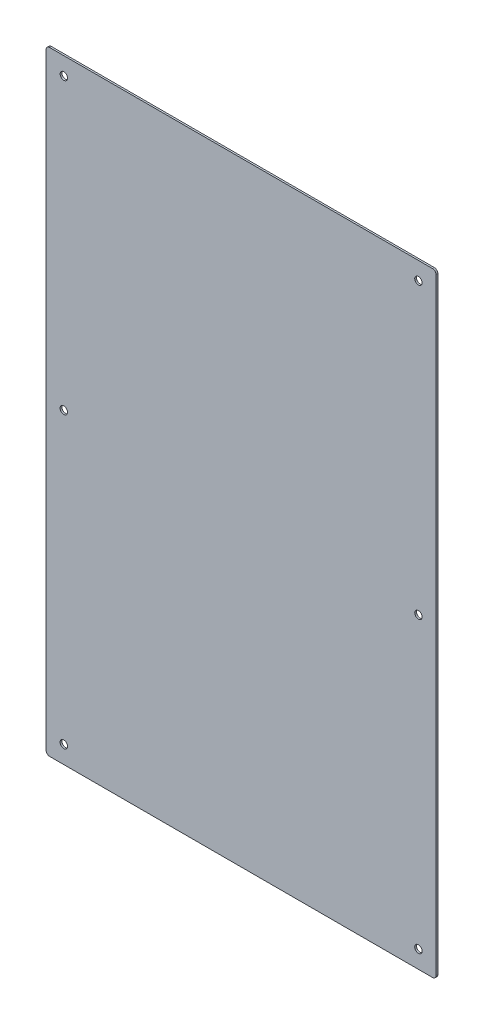
ISO-10303-21;
HEADER;
FILE_DESCRIPTION(('STEP AP214'),'2;1');
FILE_NAME('part.step','',(''),(''),'','','');
FILE_SCHEMA(('AUTOMOTIVE_DESIGN { 1 0 10303 214 1 1 1 1 }'));
ENDSEC;
DATA;
#1=APPLICATION_CONTEXT('core data for automotive mechanical design processes');
#2=APPLICATION_PROTOCOL_DEFINITION('international standard','automotive_design',2000,#1);
#3=PRODUCT_CONTEXT('',#1,'mechanical');
#4=PRODUCT('Part','Part','',(#3));
#5=PRODUCT_RELATED_PRODUCT_CATEGORY('part','',(#4));
#6=PRODUCT_DEFINITION_FORMATION('','',#4);
#7=PRODUCT_DEFINITION_CONTEXT('part definition',#1,'design');
#8=PRODUCT_DEFINITION('design','',#6,#7);
#9=PRODUCT_DEFINITION_SHAPE('','',#8);
#10=(LENGTH_UNIT() NAMED_UNIT(*) SI_UNIT(.MILLI.,.METRE.));
#11=(NAMED_UNIT(*) PLANE_ANGLE_UNIT() SI_UNIT($,.RADIAN.));
#12=(NAMED_UNIT(*) SI_UNIT($,.STERADIAN.) SOLID_ANGLE_UNIT());
#13=UNCERTAINTY_MEASURE_WITH_UNIT(LENGTH_MEASURE(1.E-05),#10,'distance_accuracy_value','');
#14=(GEOMETRIC_REPRESENTATION_CONTEXT(3) GLOBAL_UNCERTAINTY_ASSIGNED_CONTEXT((#13)) GLOBAL_UNIT_ASSIGNED_CONTEXT((#10,
#11,#12)) REPRESENTATION_CONTEXT('',''));
#15=CARTESIAN_POINT('',(0.,0.,0.));
#16=DIRECTION('',(0.,0.,1.));
#17=DIRECTION('',(1.,0.,0.));
#18=AXIS2_PLACEMENT_3D('',#15,#16,#17);
#19=CARTESIAN_POINT('',(-108.5,172.,1.));
#20=DIRECTION('',(0.,0.,-1.));
#21=DIRECTION('',(-1.,0.,0.));
#22=AXIS2_PLACEMENT_3D('',#19,#20,#21);
#23=PLANE('',#22);
#24=CARTESIAN_POINT('',(100.5,0.,1.));
#25=DIRECTION('',(0.,0.,1.));
#26=DIRECTION('',(-1.,0.,0.));
#27=AXIS2_PLACEMENT_3D('',#24,#25,#26);
#28=CIRCLE('',#27,2.1);
#29=CARTESIAN_POINT('',(98.4000000000001,0.,1.));
#30=VERTEX_POINT('',#29);
#31=EDGE_CURVE('E198',#30,#30,#28,.T.);
#32=ORIENTED_EDGE('',*,*,#31,.F.);
#33=EDGE_LOOP('',(#32));
#34=FACE_BOUND('',#33,.T.);
#35=CARTESIAN_POINT('',(-100.5,-164.,1.));
#36=DIRECTION('',(0.,0.,1.));
#37=DIRECTION('',(-1.,0.,0.));
#38=AXIS2_PLACEMENT_3D('',#35,#36,#37);
#39=CIRCLE('',#38,2.1);
#40=CARTESIAN_POINT('',(-102.6,-164.,1.));
#41=VERTEX_POINT('',#40);
#42=EDGE_CURVE('E186',#41,#41,#39,.T.);
#43=ORIENTED_EDGE('',*,*,#42,.F.);
#44=EDGE_LOOP('',(#43));
#45=FACE_BOUND('',#44,.T.);
#46=CARTESIAN_POINT('',(-100.5,164.,1.));
#47=DIRECTION('',(0.,0.,1.));
#48=DIRECTION('',(1.,0.,0.));
#49=AXIS2_PLACEMENT_3D('',#46,#47,#48);
#50=CIRCLE('',#49,2.1);
#51=CARTESIAN_POINT('',(-98.4,164.,1.));
#52=VERTEX_POINT('',#51);
#53=EDGE_CURVE('E132',#52,#52,#50,.T.);
#54=ORIENTED_EDGE('',*,*,#53,.F.);
#55=EDGE_LOOP('',(#54));
#56=FACE_BOUND('',#55,.T.);
#57=CARTESIAN_POINT('',(-108.5,172.,1.));
#58=DIRECTION('',(0.,0.,1.));
#59=DIRECTION('',(-1.,0.,0.));
#60=AXIS2_PLACEMENT_3D('',#57,#58,#59);
#61=CIRCLE('',#60,2.);
#62=CARTESIAN_POINT('',(-108.5,174.,1.));
#63=VERTEX_POINT('',#62);
#64=CARTESIAN_POINT('',(-110.5,172.,1.));
#65=VERTEX_POINT('',#64);
#66=EDGE_CURVE('E143',#63,#65,#61,.T.);
#67=ORIENTED_EDGE('',*,*,#66,.T.);
#68=DIRECTION('',(0.,-1.,0.));
#69=VECTOR('',#68,1.);
#70=CARTESIAN_POINT('',(-110.5,-172.,1.));
#71=LINE('',#70,#69);
#72=CARTESIAN_POINT('',(-110.5,-172.,1.));
#73=VERTEX_POINT('',#72);
#74=EDGE_CURVE('E91',#65,#73,#71,.T.);
#75=ORIENTED_EDGE('',*,*,#74,.T.);
#76=CARTESIAN_POINT('',(-108.5,-172.,1.));
#77=DIRECTION('',(0.,0.,1.));
#78=DIRECTION('',(-1.,0.,0.));
#79=AXIS2_PLACEMENT_3D('',#76,#77,#78);
#80=CIRCLE('',#79,2.);
#81=CARTESIAN_POINT('',(-108.5,-174.,1.));
#82=VERTEX_POINT('',#81);
#83=EDGE_CURVE('E158',#73,#82,#80,.T.);
#84=ORIENTED_EDGE('',*,*,#83,.T.);
#85=DIRECTION('',(1.,0.,0.));
#86=VECTOR('',#85,1.);
#87=CARTESIAN_POINT('',(-108.5,-174.,1.));
#88=LINE('',#87,#86);
#89=CARTESIAN_POINT('',(108.5,-174.,1.));
#90=VERTEX_POINT('',#89);
#91=EDGE_CURVE('E171',#82,#90,#88,.T.);
#92=ORIENTED_EDGE('',*,*,#91,.T.);
#93=CARTESIAN_POINT('',(108.5,-172.,1.));
#94=DIRECTION('',(0.,0.,1.));
#95=DIRECTION('',(1.,0.,0.));
#96=AXIS2_PLACEMENT_3D('',#93,#94,#95);
#97=CIRCLE('',#96,2.);
#98=CARTESIAN_POINT('',(110.5,-172.,1.));
#99=VERTEX_POINT('',#98);
#100=EDGE_CURVE('E110',#90,#99,#97,.T.);
#101=ORIENTED_EDGE('',*,*,#100,.T.);
#102=DIRECTION('',(0.,1.,0.));
#103=VECTOR('',#102,1.);
#104=CARTESIAN_POINT('',(110.5,-172.,1.));
#105=LINE('',#104,#103);
#106=CARTESIAN_POINT('',(110.5,172.,1.));
#107=VERTEX_POINT('',#106);
#108=EDGE_CURVE('E104',#99,#107,#105,.T.);
#109=ORIENTED_EDGE('',*,*,#108,.T.);
#110=CARTESIAN_POINT('',(108.5,172.,1.));
#111=DIRECTION('',(0.,0.,1.));
#112=DIRECTION('',(-1.,0.,0.));
#113=AXIS2_PLACEMENT_3D('',#110,#111,#112);
#114=CIRCLE('',#113,2.);
#115=CARTESIAN_POINT('',(108.5,174.,1.));
#116=VERTEX_POINT('',#115);
#117=EDGE_CURVE('E108',#107,#116,#114,.T.);
#118=ORIENTED_EDGE('',*,*,#117,.T.);
#119=DIRECTION('',(-1.,0.,0.));
#120=VECTOR('',#119,1.);
#121=CARTESIAN_POINT('',(-108.5,174.,1.));
#122=LINE('',#121,#120);
#123=EDGE_CURVE('E48',#116,#63,#122,.T.);
#124=ORIENTED_EDGE('',*,*,#123,.T.);
#125=EDGE_LOOP('',(#67,#75,#84,#92,#101,#109,#118,#124));
#126=FACE_BOUND('',#125,.T.);
#127=CARTESIAN_POINT('',(-100.5,0.,1.));
#128=DIRECTION('',(0.,0.,1.));
#129=DIRECTION('',(1.,0.,0.));
#130=AXIS2_PLACEMENT_3D('',#127,#128,#129);
#131=CIRCLE('',#130,2.1);
#132=CARTESIAN_POINT('',(-98.4000000000001,0.,1.));
#133=VERTEX_POINT('',#132);
#134=EDGE_CURVE('E180',#133,#133,#131,.T.);
#135=ORIENTED_EDGE('',*,*,#134,.F.);
#136=EDGE_LOOP('',(#135));
#137=FACE_BOUND('',#136,.T.);
#138=CARTESIAN_POINT('',(100.5,-164.,1.));
#139=DIRECTION('',(0.,0.,1.));
#140=DIRECTION('',(1.,0.,0.));
#141=AXIS2_PLACEMENT_3D('',#138,#139,#140);
#142=CIRCLE('',#141,2.1);
#143=CARTESIAN_POINT('',(102.6,-164.,1.));
#144=VERTEX_POINT('',#143);
#145=EDGE_CURVE('E192',#144,#144,#142,.T.);
#146=ORIENTED_EDGE('',*,*,#145,.F.);
#147=EDGE_LOOP('',(#146));
#148=FACE_BOUND('',#147,.T.);
#149=CARTESIAN_POINT('',(100.5,164.,1.));
#150=DIRECTION('',(0.,0.,1.));
#151=DIRECTION('',(-1.,0.,0.));
#152=AXIS2_PLACEMENT_3D('',#149,#150,#151);
#153=CIRCLE('',#152,2.1);
#154=CARTESIAN_POINT('',(98.4,164.,1.));
#155=VERTEX_POINT('',#154);
#156=EDGE_CURVE('E204',#155,#155,#153,.T.);
#157=ORIENTED_EDGE('',*,*,#156,.F.);
#158=EDGE_LOOP('',(#157));
#159=FACE_BOUND('',#158,.T.);
#160=ADVANCED_FACE('F31',(#34,#45,#56,#126,#137,#148,#159),#23,.F.);
#161=CARTESIAN_POINT('',(-108.5,172.,0.));
#162=DIRECTION('',(0.,0.,-1.));
#163=DIRECTION('',(-1.,0.,0.));
#164=AXIS2_PLACEMENT_3D('',#161,#162,#163);
#165=PLANE('',#164);
#166=CARTESIAN_POINT('',(100.5,0.,0.));
#167=DIRECTION('',(0.,0.,1.));
#168=DIRECTION('',(-1.,0.,0.));
#169=AXIS2_PLACEMENT_3D('',#166,#167,#168);
#170=CIRCLE('',#169,2.1);
#171=CARTESIAN_POINT('',(98.4000000000001,0.,0.));
#172=VERTEX_POINT('',#171);
#173=EDGE_CURVE('E201',#172,#172,#170,.T.);
#174=ORIENTED_EDGE('',*,*,#173,.T.);
#175=EDGE_LOOP('',(#174));
#176=FACE_BOUND('',#175,.T.);
#177=CARTESIAN_POINT('',(-100.5,-164.,0.));
#178=DIRECTION('',(0.,0.,1.));
#179=DIRECTION('',(-1.,0.,0.));
#180=AXIS2_PLACEMENT_3D('',#177,#178,#179);
#181=CIRCLE('',#180,2.1);
#182=CARTESIAN_POINT('',(-102.6,-164.,0.));
#183=VERTEX_POINT('',#182);
#184=EDGE_CURVE('E189',#183,#183,#181,.T.);
#185=ORIENTED_EDGE('',*,*,#184,.T.);
#186=EDGE_LOOP('',(#185));
#187=FACE_BOUND('',#186,.T.);
#188=CARTESIAN_POINT('',(-100.5,164.,0.));
#189=DIRECTION('',(0.,0.,1.));
#190=DIRECTION('',(1.,0.,0.));
#191=AXIS2_PLACEMENT_3D('',#188,#189,#190);
#192=CIRCLE('',#191,2.1);
#193=CARTESIAN_POINT('',(-98.4,164.,0.));
#194=VERTEX_POINT('',#193);
#195=EDGE_CURVE('E177',#194,#194,#192,.T.);
#196=ORIENTED_EDGE('',*,*,#195,.T.);
#197=EDGE_LOOP('',(#196));
#198=FACE_BOUND('',#197,.T.);
#199=CARTESIAN_POINT('',(-108.5,172.,0.));
#200=DIRECTION('',(0.,0.,1.));
#201=DIRECTION('',(-1.,0.,0.));
#202=AXIS2_PLACEMENT_3D('',#199,#200,#201);
#203=CIRCLE('',#202,2.);
#204=CARTESIAN_POINT('',(-108.5,174.,0.));
#205=VERTEX_POINT('',#204);
#206=CARTESIAN_POINT('',(-110.5,172.,0.));
#207=VERTEX_POINT('',#206);
#208=EDGE_CURVE('E128',#205,#207,#203,.T.);
#209=ORIENTED_EDGE('',*,*,#208,.F.);
#210=DIRECTION('',(-1.,0.,0.));
#211=VECTOR('',#210,1.);
#212=CARTESIAN_POINT('',(-108.5,174.,0.));
#213=LINE('',#212,#211);
#214=CARTESIAN_POINT('',(108.5,174.,0.));
#215=VERTEX_POINT('',#214);
#216=EDGE_CURVE('E83',#215,#205,#213,.T.);
#217=ORIENTED_EDGE('',*,*,#216,.F.);
#218=CARTESIAN_POINT('',(108.5,172.,0.));
#219=DIRECTION('',(0.,0.,1.));
#220=DIRECTION('',(-1.,0.,0.));
#221=AXIS2_PLACEMENT_3D('',#218,#219,#220);
#222=CIRCLE('',#221,2.);
#223=CARTESIAN_POINT('',(110.5,172.,0.));
#224=VERTEX_POINT('',#223);
#225=EDGE_CURVE('E77',#224,#215,#222,.T.);
#226=ORIENTED_EDGE('',*,*,#225,.F.);
#227=DIRECTION('',(0.,1.,0.));
#228=VECTOR('',#227,1.);
#229=CARTESIAN_POINT('',(110.5,-172.,0.));
#230=LINE('',#229,#228);
#231=CARTESIAN_POINT('',(110.5,-172.,0.));
#232=VERTEX_POINT('',#231);
#233=EDGE_CURVE('E118',#232,#224,#230,.T.);
#234=ORIENTED_EDGE('',*,*,#233,.F.);
#235=CARTESIAN_POINT('',(108.5,-172.,0.));
#236=DIRECTION('',(0.,0.,1.));
#237=DIRECTION('',(1.,0.,0.));
#238=AXIS2_PLACEMENT_3D('',#235,#236,#237);
#239=CIRCLE('',#238,2.);
#240=CARTESIAN_POINT('',(108.5,-174.,0.));
#241=VERTEX_POINT('',#240);
#242=EDGE_CURVE('E138',#241,#232,#239,.T.);
#243=ORIENTED_EDGE('',*,*,#242,.F.);
#244=DIRECTION('',(1.,0.,0.));
#245=VECTOR('',#244,1.);
#246=CARTESIAN_POINT('',(-108.5,-174.,0.));
#247=LINE('',#246,#245);
#248=CARTESIAN_POINT('',(-108.5,-174.,0.));
#249=VERTEX_POINT('',#248);
#250=EDGE_CURVE('E136',#249,#241,#247,.T.);
#251=ORIENTED_EDGE('',*,*,#250,.F.);
#252=CARTESIAN_POINT('',(-108.5,-172.,0.));
#253=DIRECTION('',(0.,0.,1.));
#254=DIRECTION('',(-1.,0.,0.));
#255=AXIS2_PLACEMENT_3D('',#252,#253,#254);
#256=CIRCLE('',#255,2.);
#257=CARTESIAN_POINT('',(-110.5,-172.,0.));
#258=VERTEX_POINT('',#257);
#259=EDGE_CURVE('E134',#258,#249,#256,.T.);
#260=ORIENTED_EDGE('',*,*,#259,.F.);
#261=DIRECTION('',(0.,-1.,0.));
#262=VECTOR('',#261,1.);
#263=CARTESIAN_POINT('',(-110.5,-172.,0.));
#264=LINE('',#263,#262);
#265=EDGE_CURVE('E131',#207,#258,#264,.T.);
#266=ORIENTED_EDGE('',*,*,#265,.F.);
#267=EDGE_LOOP('',(#209,#217,#226,#234,#243,#251,#260,#266));
#268=FACE_BOUND('',#267,.T.);
#269=CARTESIAN_POINT('',(-100.5,0.,0.));
#270=DIRECTION('',(0.,0.,1.));
#271=DIRECTION('',(1.,0.,0.));
#272=AXIS2_PLACEMENT_3D('',#269,#270,#271);
#273=CIRCLE('',#272,2.1);
#274=CARTESIAN_POINT('',(-98.4000000000001,0.,0.));
#275=VERTEX_POINT('',#274);
#276=EDGE_CURVE('E183',#275,#275,#273,.T.);
#277=ORIENTED_EDGE('',*,*,#276,.T.);
#278=EDGE_LOOP('',(#277));
#279=FACE_BOUND('',#278,.T.);
#280=CARTESIAN_POINT('',(100.5,-164.,0.));
#281=DIRECTION('',(0.,0.,1.));
#282=DIRECTION('',(1.,0.,0.));
#283=AXIS2_PLACEMENT_3D('',#280,#281,#282);
#284=CIRCLE('',#283,2.1);
#285=CARTESIAN_POINT('',(102.6,-164.,0.));
#286=VERTEX_POINT('',#285);
#287=EDGE_CURVE('E195',#286,#286,#284,.T.);
#288=ORIENTED_EDGE('',*,*,#287,.T.);
#289=EDGE_LOOP('',(#288));
#290=FACE_BOUND('',#289,.T.);
#291=CARTESIAN_POINT('',(100.5,164.,0.));
#292=DIRECTION('',(0.,0.,1.));
#293=DIRECTION('',(-1.,0.,0.));
#294=AXIS2_PLACEMENT_3D('',#291,#292,#293);
#295=CIRCLE('',#294,2.1);
#296=CARTESIAN_POINT('',(98.4,164.,0.));
#297=VERTEX_POINT('',#296);
#298=EDGE_CURVE('E207',#297,#297,#295,.T.);
#299=ORIENTED_EDGE('',*,*,#298,.T.);
#300=EDGE_LOOP('',(#299));
#301=FACE_BOUND('',#300,.T.);
#302=ADVANCED_FACE('F162',(#176,#187,#198,#268,#279,#290,#301),#165,.T.);
#303=CARTESIAN_POINT('',(-108.5,172.,1.));
#304=DIRECTION('',(0.,0.,-1.));
#305=DIRECTION('',(-1.,0.,0.));
#306=AXIS2_PLACEMENT_3D('',#303,#304,#305);
#307=CYLINDRICAL_SURFACE('',#306,2.);
#308=ORIENTED_EDGE('',*,*,#208,.T.);
#309=DIRECTION('',(0.,0.,-1.));
#310=VECTOR('',#309,1.);
#311=CARTESIAN_POINT('',(-110.5,172.,1.));
#312=LINE('',#311,#310);
#313=EDGE_CURVE('E11',#65,#207,#312,.T.);
#314=ORIENTED_EDGE('',*,*,#313,.F.);
#315=ORIENTED_EDGE('',*,*,#66,.F.);
#316=DIRECTION('',(0.,0.,-1.));
#317=VECTOR('',#316,1.);
#318=CARTESIAN_POINT('',(-108.5,174.,1.));
#319=LINE('',#318,#317);
#320=EDGE_CURVE('E124',#63,#205,#319,.T.);
#321=ORIENTED_EDGE('',*,*,#320,.T.);
#322=EDGE_LOOP('',(#308,#314,#315,#321));
#323=FACE_BOUND('',#322,.T.);
#324=ADVANCED_FACE('F33',(#323),#307,.T.);
#325=CARTESIAN_POINT('',(-110.5,-172.,1.));
#326=DIRECTION('',(1.,0.,0.));
#327=DIRECTION('',(0.,0.,-1.));
#328=AXIS2_PLACEMENT_3D('',#325,#326,#327);
#329=PLANE('',#328);
#330=ORIENTED_EDGE('',*,*,#265,.T.);
#331=DIRECTION('',(0.,0.,-1.));
#332=VECTOR('',#331,1.);
#333=CARTESIAN_POINT('',(-110.5,-172.,1.));
#334=LINE('',#333,#332);
#335=EDGE_CURVE('E40',#73,#258,#334,.T.);
#336=ORIENTED_EDGE('',*,*,#335,.F.);
#337=ORIENTED_EDGE('',*,*,#74,.F.);
#338=ORIENTED_EDGE('',*,*,#313,.T.);
#339=EDGE_LOOP('',(#330,#336,#337,#338));
#340=FACE_BOUND('',#339,.T.);
#341=ADVANCED_FACE('F242',(#340),#329,.F.);
#342=CARTESIAN_POINT('',(-108.5,-172.,1.));
#343=DIRECTION('',(0.,0.,-1.));
#344=DIRECTION('',(-1.,0.,0.));
#345=AXIS2_PLACEMENT_3D('',#342,#343,#344);
#346=CYLINDRICAL_SURFACE('',#345,2.);
#347=ORIENTED_EDGE('',*,*,#259,.T.);
#348=DIRECTION('',(0.,0.,-1.));
#349=VECTOR('',#348,1.);
#350=CARTESIAN_POINT('',(-108.5,-174.,1.));
#351=LINE('',#350,#349);
#352=EDGE_CURVE('E150',#82,#249,#351,.T.);
#353=ORIENTED_EDGE('',*,*,#352,.F.);
#354=ORIENTED_EDGE('',*,*,#83,.F.);
#355=ORIENTED_EDGE('',*,*,#335,.T.);
#356=EDGE_LOOP('',(#347,#353,#354,#355));
#357=FACE_BOUND('',#356,.T.);
#358=ADVANCED_FACE('F156',(#357),#346,.T.);
#359=CARTESIAN_POINT('',(-108.5,-174.,1.));
#360=DIRECTION('',(0.,1.,0.));
#361=DIRECTION('',(0.,0.,1.));
#362=AXIS2_PLACEMENT_3D('',#359,#360,#361);
#363=PLANE('',#362);
#364=ORIENTED_EDGE('',*,*,#250,.T.);
#365=DIRECTION('',(0.,0.,-1.));
#366=VECTOR('',#365,1.);
#367=CARTESIAN_POINT('',(108.5,-174.,1.));
#368=LINE('',#367,#366);
#369=EDGE_CURVE('E147',#90,#241,#368,.T.);
#370=ORIENTED_EDGE('',*,*,#369,.F.);
#371=ORIENTED_EDGE('',*,*,#91,.F.);
#372=ORIENTED_EDGE('',*,*,#352,.T.);
#373=EDGE_LOOP('',(#364,#370,#371,#372));
#374=FACE_BOUND('',#373,.T.);
#375=ADVANCED_FACE('F167',(#374),#363,.F.);
#376=CARTESIAN_POINT('',(108.5,-172.,1.));
#377=DIRECTION('',(0.,0.,-1.));
#378=DIRECTION('',(-1.,0.,0.));
#379=AXIS2_PLACEMENT_3D('',#376,#377,#378);
#380=CYLINDRICAL_SURFACE('',#379,2.);
#381=ORIENTED_EDGE('',*,*,#242,.T.);
#382=DIRECTION('',(0.,0.,-1.));
#383=VECTOR('',#382,1.);
#384=CARTESIAN_POINT('',(110.5,-172.,1.));
#385=LINE('',#384,#383);
#386=EDGE_CURVE('E119',#99,#232,#385,.T.);
#387=ORIENTED_EDGE('',*,*,#386,.F.);
#388=ORIENTED_EDGE('',*,*,#100,.F.);
#389=ORIENTED_EDGE('',*,*,#369,.T.);
#390=EDGE_LOOP('',(#381,#387,#388,#389));
#391=FACE_BOUND('',#390,.T.);
#392=ADVANCED_FACE('F170',(#391),#380,.T.);
#393=CARTESIAN_POINT('',(110.5,-172.,1.));
#394=DIRECTION('',(-1.,0.,0.));
#395=DIRECTION('',(0.,0.,1.));
#396=AXIS2_PLACEMENT_3D('',#393,#394,#395);
#397=PLANE('',#396);
#398=ORIENTED_EDGE('',*,*,#233,.T.);
#399=DIRECTION('',(0.,0.,-1.));
#400=VECTOR('',#399,1.);
#401=CARTESIAN_POINT('',(110.5,172.,1.));
#402=LINE('',#401,#400);
#403=EDGE_CURVE('E115',#107,#224,#402,.T.);
#404=ORIENTED_EDGE('',*,*,#403,.F.);
#405=ORIENTED_EDGE('',*,*,#108,.F.);
#406=ORIENTED_EDGE('',*,*,#386,.T.);
#407=EDGE_LOOP('',(#398,#404,#405,#406));
#408=FACE_BOUND('',#407,.T.);
#409=ADVANCED_FACE('F116',(#408),#397,.F.);
#410=CARTESIAN_POINT('',(108.5,172.,1.));
#411=DIRECTION('',(0.,0.,-1.));
#412=DIRECTION('',(-1.,0.,0.));
#413=AXIS2_PLACEMENT_3D('',#410,#411,#412);
#414=CYLINDRICAL_SURFACE('',#413,2.);
#415=ORIENTED_EDGE('',*,*,#225,.T.);
#416=DIRECTION('',(0.,0.,-1.));
#417=VECTOR('',#416,1.);
#418=CARTESIAN_POINT('',(108.5,174.,1.));
#419=LINE('',#418,#417);
#420=EDGE_CURVE('E120',#116,#215,#419,.T.);
#421=ORIENTED_EDGE('',*,*,#420,.F.);
#422=ORIENTED_EDGE('',*,*,#117,.F.);
#423=ORIENTED_EDGE('',*,*,#403,.T.);
#424=EDGE_LOOP('',(#415,#421,#422,#423));
#425=FACE_BOUND('',#424,.T.);
#426=ADVANCED_FACE('F122',(#425),#414,.T.);
#427=CARTESIAN_POINT('',(-108.5,174.,1.));
#428=DIRECTION('',(0.,-1.,0.));
#429=DIRECTION('',(0.,0.,-1.));
#430=AXIS2_PLACEMENT_3D('',#427,#428,#429);
#431=PLANE('',#430);
#432=ORIENTED_EDGE('',*,*,#216,.T.);
#433=ORIENTED_EDGE('',*,*,#320,.F.);
#434=ORIENTED_EDGE('',*,*,#123,.F.);
#435=ORIENTED_EDGE('',*,*,#420,.T.);
#436=EDGE_LOOP('',(#432,#433,#434,#435));
#437=FACE_BOUND('',#436,.T.);
#438=ADVANCED_FACE('F230',(#437),#431,.F.);
#439=CARTESIAN_POINT('',(-100.5,164.,1.));
#440=DIRECTION('',(0.,0.,-1.));
#441=DIRECTION('',(-1.,0.,0.));
#442=AXIS2_PLACEMENT_3D('',#439,#440,#441);
#443=CYLINDRICAL_SURFACE('',#442,2.1);
#444=ORIENTED_EDGE('',*,*,#53,.T.);
#445=EDGE_LOOP('',(#444));
#446=FACE_BOUND('',#445,.T.);
#447=ORIENTED_EDGE('',*,*,#195,.F.);
#448=EDGE_LOOP('',(#447));
#449=FACE_BOUND('',#448,.T.);
#450=ADVANCED_FACE('F227',(#446,#449),#443,.F.);
#451=CARTESIAN_POINT('',(-100.5,0.,1.));
#452=DIRECTION('',(0.,0.,-1.));
#453=DIRECTION('',(-1.,0.,0.));
#454=AXIS2_PLACEMENT_3D('',#451,#452,#453);
#455=CYLINDRICAL_SURFACE('',#454,2.1);
#456=ORIENTED_EDGE('',*,*,#134,.T.);
#457=EDGE_LOOP('',(#456));
#458=FACE_BOUND('',#457,.T.);
#459=ORIENTED_EDGE('',*,*,#276,.F.);
#460=EDGE_LOOP('',(#459));
#461=FACE_BOUND('',#460,.T.);
#462=ADVANCED_FACE('F306',(#458,#461),#455,.F.);
#463=CARTESIAN_POINT('',(-100.5,-164.,1.));
#464=DIRECTION('',(0.,0.,-1.));
#465=DIRECTION('',(-1.,0.,0.));
#466=AXIS2_PLACEMENT_3D('',#463,#464,#465);
#467=CYLINDRICAL_SURFACE('',#466,2.1);
#468=ORIENTED_EDGE('',*,*,#42,.T.);
#469=EDGE_LOOP('',(#468));
#470=FACE_BOUND('',#469,.T.);
#471=ORIENTED_EDGE('',*,*,#184,.F.);
#472=EDGE_LOOP('',(#471));
#473=FACE_BOUND('',#472,.T.);
#474=ADVANCED_FACE('F314',(#470,#473),#467,.F.);
#475=CARTESIAN_POINT('',(100.5,-164.,1.));
#476=DIRECTION('',(0.,0.,-1.));
#477=DIRECTION('',(-1.,0.,0.));
#478=AXIS2_PLACEMENT_3D('',#475,#476,#477);
#479=CYLINDRICAL_SURFACE('',#478,2.1);
#480=ORIENTED_EDGE('',*,*,#145,.T.);
#481=EDGE_LOOP('',(#480));
#482=FACE_BOUND('',#481,.T.);
#483=ORIENTED_EDGE('',*,*,#287,.F.);
#484=EDGE_LOOP('',(#483));
#485=FACE_BOUND('',#484,.T.);
#486=ADVANCED_FACE('F322',(#482,#485),#479,.F.);
#487=CARTESIAN_POINT('',(100.5,0.,1.));
#488=DIRECTION('',(0.,0.,-1.));
#489=DIRECTION('',(-1.,0.,0.));
#490=AXIS2_PLACEMENT_3D('',#487,#488,#489);
#491=CYLINDRICAL_SURFACE('',#490,2.1);
#492=ORIENTED_EDGE('',*,*,#31,.T.);
#493=EDGE_LOOP('',(#492));
#494=FACE_BOUND('',#493,.T.);
#495=ORIENTED_EDGE('',*,*,#173,.F.);
#496=EDGE_LOOP('',(#495));
#497=FACE_BOUND('',#496,.T.);
#498=ADVANCED_FACE('F331',(#494,#497),#491,.F.);
#499=CARTESIAN_POINT('',(100.5,164.,1.));
#500=DIRECTION('',(0.,0.,-1.));
#501=DIRECTION('',(-1.,0.,0.));
#502=AXIS2_PLACEMENT_3D('',#499,#500,#501);
#503=CYLINDRICAL_SURFACE('',#502,2.1);
#504=ORIENTED_EDGE('',*,*,#156,.T.);
#505=EDGE_LOOP('',(#504));
#506=FACE_BOUND('',#505,.T.);
#507=ORIENTED_EDGE('',*,*,#298,.F.);
#508=EDGE_LOOP('',(#507));
#509=FACE_BOUND('',#508,.T.);
#510=ADVANCED_FACE('F213',(#506,#509),#503,.F.);
#511=CLOSED_SHELL('',(#160,#302,#324,#341,#358,#375,#392,#409,#426,#438,#450,#462,#474,#486,
#498,#510));
#512=MANIFOLD_SOLID_BREP('B2',#511);
#513=ADVANCED_BREP_SHAPE_REPRESENTATION('',(#18,#512),#14);
#514=SHAPE_DEFINITION_REPRESENTATION(#9,#513);
ENDSEC;
END-ISO-10303-21;
